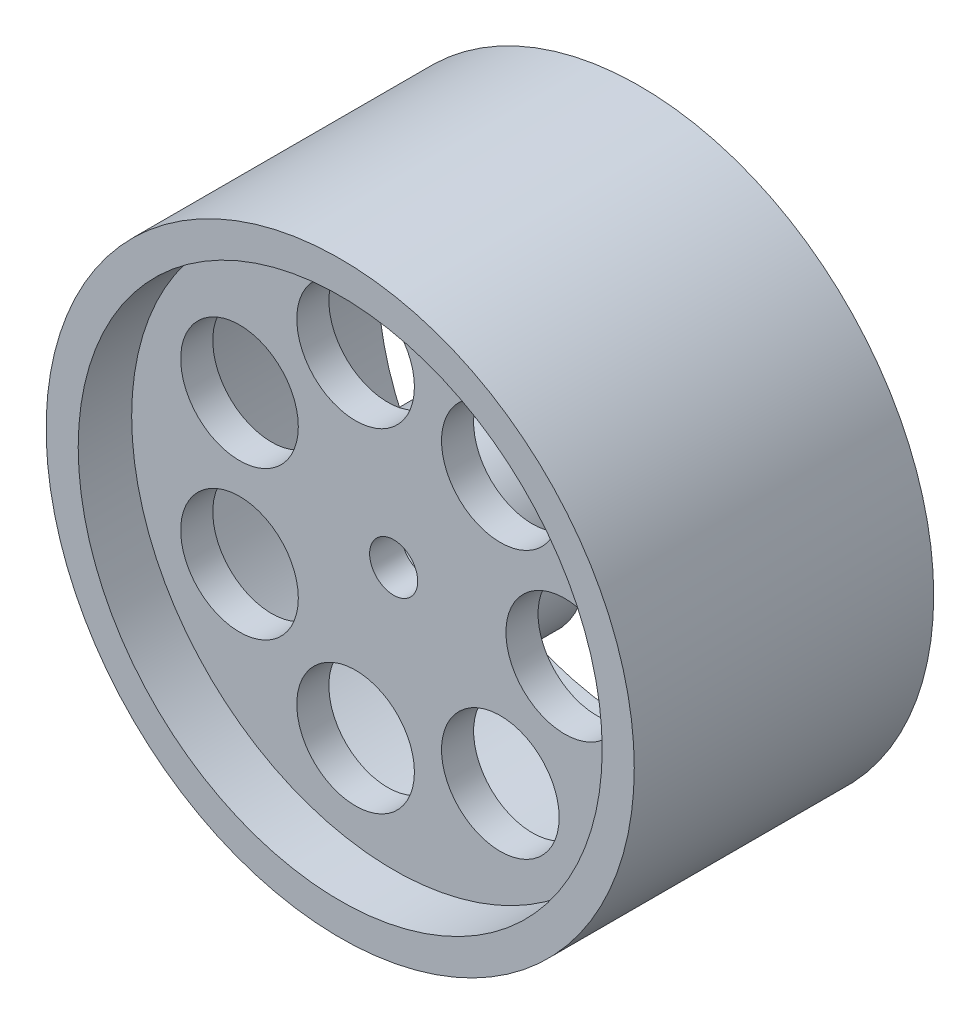
ISO-10303-21;
HEADER;
FILE_DESCRIPTION(('STEP AP214'),'2;1');
FILE_NAME('part.step','',(''),(''),'','','');
FILE_SCHEMA(('AUTOMOTIVE_DESIGN { 1 0 10303 214 1 1 1 1 }'));
ENDSEC;
DATA;
#1=APPLICATION_CONTEXT('core data for automotive mechanical design processes');
#2=APPLICATION_PROTOCOL_DEFINITION('international standard','automotive_design',2000,#1);
#3=PRODUCT_CONTEXT('',#1,'mechanical');
#4=PRODUCT('Part','Part','',(#3));
#5=PRODUCT_RELATED_PRODUCT_CATEGORY('part','',(#4));
#6=PRODUCT_DEFINITION_FORMATION('','',#4);
#7=PRODUCT_DEFINITION_CONTEXT('part definition',#1,'design');
#8=PRODUCT_DEFINITION('design','',#6,#7);
#9=PRODUCT_DEFINITION_SHAPE('','',#8);
#10=(LENGTH_UNIT() NAMED_UNIT(*) SI_UNIT(.MILLI.,.METRE.));
#11=(NAMED_UNIT(*) PLANE_ANGLE_UNIT() SI_UNIT($,.RADIAN.));
#12=(NAMED_UNIT(*) SI_UNIT($,.STERADIAN.) SOLID_ANGLE_UNIT());
#13=UNCERTAINTY_MEASURE_WITH_UNIT(LENGTH_MEASURE(1.E-05),#10,'distance_accuracy_value','');
#14=(GEOMETRIC_REPRESENTATION_CONTEXT(3) GLOBAL_UNCERTAINTY_ASSIGNED_CONTEXT((#13)) GLOBAL_UNIT_ASSIGNED_CONTEXT((#10,
#11,#12)) REPRESENTATION_CONTEXT('',''));
#15=CARTESIAN_POINT('',(0.,0.,0.));
#16=DIRECTION('',(0.,0.,1.));
#17=DIRECTION('',(1.,0.,0.));
#18=AXIS2_PLACEMENT_3D('',#15,#16,#17);
#19=CARTESIAN_POINT('',(0.,0.,6.));
#20=DIRECTION('',(0.,0.,1.));
#21=DIRECTION('',(1.,0.,0.));
#22=AXIS2_PLACEMENT_3D('',#19,#20,#21);
#23=PLANE('',#22);
#24=CARTESIAN_POINT('',(9.97583682973973,-12.5093037194885,6.));
#25=DIRECTION('',(0.,0.,1.));
#26=DIRECTION('',(1.,0.,0.));
#27=AXIS2_PLACEMENT_3D('',#24,#25,#26);
#28=CIRCLE('',#27,5.5);
#29=CARTESIAN_POINT('',(15.4758368297397,-12.5093037194885,6.));
#30=VERTEX_POINT('',#29);
#31=EDGE_CURVE('E152',#30,#30,#28,.T.);
#32=ORIENTED_EDGE('',*,*,#31,.T.);
#33=EDGE_LOOP('',(#32));
#34=FACE_BOUND('',#33,.T.);
#35=CARTESIAN_POINT('',(-3.56033494330102,-15.5988465949092,6.));
#36=DIRECTION('',(0.,0.,1.));
#37=DIRECTION('',(1.,0.,0.));
#38=AXIS2_PLACEMENT_3D('',#35,#36,#37);
#39=CIRCLE('',#38,5.5);
#40=CARTESIAN_POINT('',(1.93966505669898,-15.5988465949092,6.));
#41=VERTEX_POINT('',#40);
#42=EDGE_CURVE('E156',#41,#41,#39,.T.);
#43=ORIENTED_EDGE('',*,*,#42,.T.);
#44=EDGE_LOOP('',(#43));
#45=FACE_BOUND('',#44,.T.);
#46=CARTESIAN_POINT('',(-14.4155018864387,-6.94213982588093,6.));
#47=DIRECTION('',(0.,0.,1.));
#48=DIRECTION('',(1.,0.,0.));
#49=AXIS2_PLACEMENT_3D('',#46,#47,#48);
#50=CIRCLE('',#49,5.5);
#51=CARTESIAN_POINT('',(-8.91550188643871,-6.94213982588093,6.));
#52=VERTEX_POINT('',#51);
#53=EDGE_CURVE('E162',#52,#52,#50,.T.);
#54=ORIENTED_EDGE('',*,*,#53,.T.);
#55=EDGE_LOOP('',(#54));
#56=FACE_BOUND('',#55,.T.);
#57=CARTESIAN_POINT('',(-14.4155018864387,6.94213982588093,6.));
#58=DIRECTION('',(0.,0.,1.));
#59=DIRECTION('',(1.,0.,0.));
#60=AXIS2_PLACEMENT_3D('',#57,#58,#59);
#61=CIRCLE('',#60,5.5);
#62=CARTESIAN_POINT('',(-8.9155018864387,6.94213982588093,6.));
#63=VERTEX_POINT('',#62);
#64=EDGE_CURVE('E168',#63,#63,#61,.T.);
#65=ORIENTED_EDGE('',*,*,#64,.T.);
#66=EDGE_LOOP('',(#65));
#67=FACE_BOUND('',#66,.T.);
#68=CARTESIAN_POINT('',(-3.56033494330103,15.5988465949092,6.));
#69=DIRECTION('',(0.,0.,1.));
#70=DIRECTION('',(1.,0.,0.));
#71=AXIS2_PLACEMENT_3D('',#68,#69,#70);
#72=CIRCLE('',#71,5.5);
#73=CARTESIAN_POINT('',(1.93966505669897,15.5988465949092,6.));
#74=VERTEX_POINT('',#73);
#75=EDGE_CURVE('E174',#74,#74,#72,.T.);
#76=ORIENTED_EDGE('',*,*,#75,.T.);
#77=EDGE_LOOP('',(#76));
#78=FACE_BOUND('',#77,.T.);
#79=CARTESIAN_POINT('',(9.97583682973974,12.5093037194885,6.));
#80=DIRECTION('',(0.,0.,1.));
#81=DIRECTION('',(1.,0.,0.));
#82=AXIS2_PLACEMENT_3D('',#79,#80,#81);
#83=CIRCLE('',#82,5.5);
#84=CARTESIAN_POINT('',(15.4758368297397,12.5093037194885,6.));
#85=VERTEX_POINT('',#84);
#86=EDGE_CURVE('E180',#85,#85,#83,.T.);
#87=ORIENTED_EDGE('',*,*,#86,.T.);
#88=EDGE_LOOP('',(#87));
#89=FACE_BOUND('',#88,.T.);
#90=CARTESIAN_POINT('',(16.,0.,6.));
#91=DIRECTION('',(0.,0.,1.));
#92=DIRECTION('',(1.,0.,0.));
#93=AXIS2_PLACEMENT_3D('',#90,#91,#92);
#94=CIRCLE('',#93,5.5);
#95=CARTESIAN_POINT('',(21.5,0.,6.));
#96=VERTEX_POINT('',#95);
#97=EDGE_CURVE('E186',#96,#96,#94,.T.);
#98=ORIENTED_EDGE('',*,*,#97,.T.);
#99=EDGE_LOOP('',(#98));
#100=FACE_BOUND('',#99,.T.);
#101=CARTESIAN_POINT('',(0.,0.,6.));
#102=DIRECTION('',(0.,0.,1.));
#103=DIRECTION('',(1.,0.,0.));
#104=AXIS2_PLACEMENT_3D('',#101,#102,#103);
#105=CIRCLE('',#104,24.5);
#106=CARTESIAN_POINT('',(24.5,0.,6.));
#107=VERTEX_POINT('',#106);
#108=EDGE_CURVE('E198',#107,#107,#105,.T.);
#109=ORIENTED_EDGE('',*,*,#108,.F.);
#110=EDGE_LOOP('',(#109));
#111=FACE_BOUND('',#110,.T.);
#112=CARTESIAN_POINT('',(0.,0.,6.));
#113=DIRECTION('',(0.,0.,1.));
#114=DIRECTION('',(1.,0.,0.));
#115=AXIS2_PLACEMENT_3D('',#112,#113,#114);
#116=CIRCLE('',#115,9.);
#117=CARTESIAN_POINT('',(9.,0.,6.));
#118=VERTEX_POINT('',#117);
#119=EDGE_CURVE('E11',#118,#118,#116,.F.);
#120=ORIENTED_EDGE('',*,*,#119,.F.);
#121=EDGE_LOOP('',(#120));
#122=FACE_BOUND('',#121,.T.);
#123=ADVANCED_FACE('F43',(#34,#45,#56,#67,#78,#89,#100,#111,#122),#23,.F.);
#124=CARTESIAN_POINT('',(0.,0.,14.));
#125=DIRECTION('',(0.,0.,-1.));
#126=DIRECTION('',(-1.,0.,0.));
#127=AXIS2_PLACEMENT_3D('',#124,#125,#126);
#128=CYLINDRICAL_SURFACE('',#127,24.5);
#129=CARTESIAN_POINT('',(0.,0.,-14.));
#130=DIRECTION('',(0.,0.,1.));
#131=DIRECTION('',(1.,0.,0.));
#132=AXIS2_PLACEMENT_3D('',#129,#130,#131);
#133=CIRCLE('',#132,24.5);
#134=CARTESIAN_POINT('',(24.5,0.,-14.));
#135=VERTEX_POINT('',#134);
#136=EDGE_CURVE('E205',#135,#135,#133,.T.);
#137=ORIENTED_EDGE('',*,*,#136,.F.);
#138=EDGE_LOOP('',(#137));
#139=FACE_BOUND('',#138,.T.);
#140=ORIENTED_EDGE('',*,*,#108,.T.);
#141=EDGE_LOOP('',(#140));
#142=FACE_BOUND('',#141,.T.);
#143=ADVANCED_FACE('F223',(#139,#142),#128,.F.);
#144=CARTESIAN_POINT('',(0.,0.,14.));
#145=DIRECTION('',(0.,0.,1.));
#146=DIRECTION('',(1.,0.,0.));
#147=AXIS2_PLACEMENT_3D('',#144,#145,#146);
#148=PLANE('',#147);
#149=CARTESIAN_POINT('',(0.,0.,14.));
#150=DIRECTION('',(0.,0.,1.));
#151=DIRECTION('',(1.,0.,0.));
#152=AXIS2_PLACEMENT_3D('',#149,#150,#151);
#153=CIRCLE('',#152,27.5);
#154=CARTESIAN_POINT('',(27.5,0.,14.));
#155=VERTEX_POINT('',#154);
#156=EDGE_CURVE('E208',#155,#155,#153,.T.);
#157=ORIENTED_EDGE('',*,*,#156,.T.);
#158=EDGE_LOOP('',(#157));
#159=FACE_BOUND('',#158,.T.);
#160=CARTESIAN_POINT('',(0.,0.,14.));
#161=DIRECTION('',(0.,0.,1.));
#162=DIRECTION('',(1.,0.,0.));
#163=AXIS2_PLACEMENT_3D('',#160,#161,#162);
#164=CIRCLE('',#163,24.5);
#165=CARTESIAN_POINT('',(24.5,0.,14.));
#166=VERTEX_POINT('',#165);
#167=EDGE_CURVE('E201',#166,#166,#164,.T.);
#168=ORIENTED_EDGE('',*,*,#167,.F.);
#169=EDGE_LOOP('',(#168));
#170=FACE_BOUND('',#169,.T.);
#171=ADVANCED_FACE('F226',(#159,#170),#148,.T.);
#172=CARTESIAN_POINT('',(0.,0.,-14.));
#173=DIRECTION('',(0.,0.,1.));
#174=DIRECTION('',(1.,0.,0.));
#175=AXIS2_PLACEMENT_3D('',#172,#173,#174);
#176=PLANE('',#175);
#177=CARTESIAN_POINT('',(0.,0.,-14.));
#178=DIRECTION('',(0.,0.,1.));
#179=DIRECTION('',(1.,0.,0.));
#180=AXIS2_PLACEMENT_3D('',#177,#178,#179);
#181=CIRCLE('',#180,27.5);
#182=CARTESIAN_POINT('',(27.5,0.,-14.));
#183=VERTEX_POINT('',#182);
#184=EDGE_CURVE('E204',#183,#183,#181,.T.);
#185=ORIENTED_EDGE('',*,*,#184,.F.);
#186=EDGE_LOOP('',(#185));
#187=FACE_BOUND('',#186,.T.);
#188=ORIENTED_EDGE('',*,*,#136,.T.);
#189=EDGE_LOOP('',(#188));
#190=FACE_BOUND('',#189,.T.);
#191=ADVANCED_FACE('F228',(#187,#190),#176,.F.);
#192=CARTESIAN_POINT('',(0.,0.,14.));
#193=DIRECTION('',(0.,0.,-1.));
#194=DIRECTION('',(-1.,0.,0.));
#195=AXIS2_PLACEMENT_3D('',#192,#193,#194);
#196=CYLINDRICAL_SURFACE('',#195,27.5);
#197=ORIENTED_EDGE('',*,*,#156,.F.);
#198=EDGE_LOOP('',(#197));
#199=FACE_BOUND('',#198,.T.);
#200=ORIENTED_EDGE('',*,*,#184,.T.);
#201=EDGE_LOOP('',(#200));
#202=FACE_BOUND('',#201,.T.);
#203=ADVANCED_FACE('F45',(#199,#202),#196,.T.);
#204=CARTESIAN_POINT('',(0.,0.,9.));
#205=DIRECTION('',(0.,0.,1.));
#206=DIRECTION('',(1.,0.,0.));
#207=AXIS2_PLACEMENT_3D('',#204,#205,#206);
#208=CIRCLE('',#207,24.5);
#209=CARTESIAN_POINT('',(24.5,0.,9.));
#210=VERTEX_POINT('',#209);
#211=EDGE_CURVE('E51',#210,#210,#208,.T.);
#212=ORIENTED_EDGE('',*,*,#211,.F.);
#213=EDGE_LOOP('',(#212));
#214=FACE_BOUND('',#213,.T.);
#215=ORIENTED_EDGE('',*,*,#167,.T.);
#216=EDGE_LOOP('',(#215));
#217=FACE_BOUND('',#216,.T.);
#218=ADVANCED_FACE('F219',(#214,#217),#128,.F.);
#219=CARTESIAN_POINT('',(0.,0.,9.));
#220=DIRECTION('',(0.,0.,1.));
#221=DIRECTION('',(1.,0.,0.));
#222=AXIS2_PLACEMENT_3D('',#219,#220,#221);
#223=PLANE('',#222);
#224=CARTESIAN_POINT('',(9.97583682973973,-12.5093037194885,9.));
#225=DIRECTION('',(0.,0.,1.));
#226=DIRECTION('',(1.,0.,0.));
#227=AXIS2_PLACEMENT_3D('',#224,#225,#226);
#228=CIRCLE('',#227,5.5);
#229=CARTESIAN_POINT('',(15.4758368297397,-12.5093037194885,9.));
#230=VERTEX_POINT('',#229);
#231=EDGE_CURVE('E153',#230,#230,#228,.T.);
#232=ORIENTED_EDGE('',*,*,#231,.F.);
#233=EDGE_LOOP('',(#232));
#234=FACE_BOUND('',#233,.T.);
#235=CARTESIAN_POINT('',(-14.4155018864387,-6.94213982588093,9.));
#236=DIRECTION('',(0.,0.,1.));
#237=DIRECTION('',(1.,0.,0.));
#238=AXIS2_PLACEMENT_3D('',#235,#236,#237);
#239=CIRCLE('',#238,5.5);
#240=CARTESIAN_POINT('',(-8.91550188643871,-6.94213982588093,9.));
#241=VERTEX_POINT('',#240);
#242=EDGE_CURVE('E165',#241,#241,#239,.T.);
#243=ORIENTED_EDGE('',*,*,#242,.F.);
#244=EDGE_LOOP('',(#243));
#245=FACE_BOUND('',#244,.T.);
#246=CARTESIAN_POINT('',(-3.56033494330103,15.5988465949092,9.));
#247=DIRECTION('',(0.,0.,1.));
#248=DIRECTION('',(1.,0.,0.));
#249=AXIS2_PLACEMENT_3D('',#246,#247,#248);
#250=CIRCLE('',#249,5.5);
#251=CARTESIAN_POINT('',(1.93966505669897,15.5988465949092,9.));
#252=VERTEX_POINT('',#251);
#253=EDGE_CURVE('E177',#252,#252,#250,.T.);
#254=ORIENTED_EDGE('',*,*,#253,.F.);
#255=EDGE_LOOP('',(#254));
#256=FACE_BOUND('',#255,.T.);
#257=CARTESIAN_POINT('',(16.,0.,9.));
#258=DIRECTION('',(0.,0.,1.));
#259=DIRECTION('',(1.,0.,0.));
#260=AXIS2_PLACEMENT_3D('',#257,#258,#259);
#261=CIRCLE('',#260,5.5);
#262=CARTESIAN_POINT('',(21.5,0.,9.));
#263=VERTEX_POINT('',#262);
#264=EDGE_CURVE('E189',#263,#263,#261,.T.);
#265=ORIENTED_EDGE('',*,*,#264,.F.);
#266=EDGE_LOOP('',(#265));
#267=FACE_BOUND('',#266,.T.);
#268=CARTESIAN_POINT('',(0.,0.,9.));
#269=DIRECTION('',(0.,0.,1.));
#270=DIRECTION('',(1.,0.,0.));
#271=AXIS2_PLACEMENT_3D('',#268,#269,#270);
#272=CIRCLE('',#271,2.25);
#273=CARTESIAN_POINT('',(2.25,0.,9.));
#274=VERTEX_POINT('',#273);
#275=EDGE_CURVE('E195',#274,#274,#272,.T.);
#276=ORIENTED_EDGE('',*,*,#275,.F.);
#277=EDGE_LOOP('',(#276));
#278=FACE_BOUND('',#277,.T.);
#279=CARTESIAN_POINT('',(9.97583682973974,12.5093037194885,9.));
#280=DIRECTION('',(0.,0.,1.));
#281=DIRECTION('',(1.,0.,0.));
#282=AXIS2_PLACEMENT_3D('',#279,#280,#281);
#283=CIRCLE('',#282,5.5);
#284=CARTESIAN_POINT('',(15.4758368297397,12.5093037194885,9.));
#285=VERTEX_POINT('',#284);
#286=EDGE_CURVE('E183',#285,#285,#283,.T.);
#287=ORIENTED_EDGE('',*,*,#286,.F.);
#288=EDGE_LOOP('',(#287));
#289=FACE_BOUND('',#288,.T.);
#290=CARTESIAN_POINT('',(-14.4155018864387,6.94213982588093,9.));
#291=DIRECTION('',(0.,0.,1.));
#292=DIRECTION('',(1.,0.,0.));
#293=AXIS2_PLACEMENT_3D('',#290,#291,#292);
#294=CIRCLE('',#293,5.5);
#295=CARTESIAN_POINT('',(-8.9155018864387,6.94213982588093,9.));
#296=VERTEX_POINT('',#295);
#297=EDGE_CURVE('E171',#296,#296,#294,.T.);
#298=ORIENTED_EDGE('',*,*,#297,.F.);
#299=EDGE_LOOP('',(#298));
#300=FACE_BOUND('',#299,.T.);
#301=CARTESIAN_POINT('',(-3.56033494330102,-15.5988465949092,9.));
#302=DIRECTION('',(0.,0.,1.));
#303=DIRECTION('',(1.,0.,0.));
#304=AXIS2_PLACEMENT_3D('',#301,#302,#303);
#305=CIRCLE('',#304,5.5);
#306=CARTESIAN_POINT('',(1.93966505669898,-15.5988465949092,9.));
#307=VERTEX_POINT('',#306);
#308=EDGE_CURVE('E159',#307,#307,#305,.T.);
#309=ORIENTED_EDGE('',*,*,#308,.F.);
#310=EDGE_LOOP('',(#309));
#311=FACE_BOUND('',#310,.T.);
#312=ORIENTED_EDGE('',*,*,#211,.T.);
#313=EDGE_LOOP('',(#312));
#314=FACE_BOUND('',#313,.T.);
#315=ADVANCED_FACE('F217',(#234,#245,#256,#267,#278,#289,#300,#311,#314),#223,.T.);
#316=DIRECTION('',(-0.866025403784439,0.5,0.));
#317=VECTOR('',#316,1.);
#318=CARTESIAN_POINT('',(6.06,3.49874263128913,6.));
#319=LINE('',#318,#317);
#320=CARTESIAN_POINT('',(6.06,3.49874263128913,6.));
#321=VERTEX_POINT('',#320);
#322=CARTESIAN_POINT('',(0.,6.99748526257826,6.));
#323=VERTEX_POINT('',#322);
#324=EDGE_CURVE('E105',#321,#323,#319,.T.);
#325=ORIENTED_EDGE('',*,*,#324,.F.);
#326=DIRECTION('',(0.,1.,0.));
#327=VECTOR('',#326,1.);
#328=CARTESIAN_POINT('',(6.06,-3.49874263128914,6.));
#329=LINE('',#328,#327);
#330=CARTESIAN_POINT('',(6.06,-3.49874263128914,6.));
#331=VERTEX_POINT('',#330);
#332=EDGE_CURVE('E97',#331,#321,#329,.T.);
#333=ORIENTED_EDGE('',*,*,#332,.F.);
#334=DIRECTION('',(0.866025403784439,0.5,0.));
#335=VECTOR('',#334,1.);
#336=CARTESIAN_POINT('',(0.,-6.99748526257826,6.));
#337=LINE('',#336,#335);
#338=CARTESIAN_POINT('',(0.,-6.99748526257826,6.));
#339=VERTEX_POINT('',#338);
#340=EDGE_CURVE('E127',#339,#331,#337,.T.);
#341=ORIENTED_EDGE('',*,*,#340,.F.);
#342=DIRECTION('',(0.866025403784439,-0.5,0.));
#343=VECTOR('',#342,1.);
#344=CARTESIAN_POINT('',(-6.06,-3.49874263128913,6.));
#345=LINE('',#344,#343);
#346=CARTESIAN_POINT('',(-6.06,-3.49874263128913,6.));
#347=VERTEX_POINT('',#346);
#348=EDGE_CURVE('E58',#347,#339,#345,.T.);
#349=ORIENTED_EDGE('',*,*,#348,.F.);
#350=DIRECTION('',(0.,-1.,0.));
#351=VECTOR('',#350,1.);
#352=CARTESIAN_POINT('',(-6.06,3.49874263128913,6.));
#353=LINE('',#352,#351);
#354=CARTESIAN_POINT('',(-6.06,3.49874263128913,6.));
#355=VERTEX_POINT('',#354);
#356=EDGE_CURVE('E122',#355,#347,#353,.T.);
#357=ORIENTED_EDGE('',*,*,#356,.F.);
#358=DIRECTION('',(-0.866025403784439,-0.5,0.));
#359=VECTOR('',#358,1.);
#360=CARTESIAN_POINT('',(0.,6.99748526257826,6.));
#361=LINE('',#360,#359);
#362=EDGE_CURVE('E120',#323,#355,#361,.T.);
#363=ORIENTED_EDGE('',*,*,#362,.F.);
#364=EDGE_LOOP('',(#325,#333,#341,#349,#357,#363));
#365=FACE_BOUND('',#364,.T.);
#366=CARTESIAN_POINT('',(0.,0.,6.));
#367=DIRECTION('',(0.,0.,1.));
#368=DIRECTION('',(1.,0.,0.));
#369=AXIS2_PLACEMENT_3D('',#366,#367,#368);
#370=CIRCLE('',#369,2.25);
#371=CARTESIAN_POINT('',(2.25,0.,6.));
#372=VERTEX_POINT('',#371);
#373=EDGE_CURVE('E192',#372,#372,#370,.T.);
#374=ORIENTED_EDGE('',*,*,#373,.T.);
#375=EDGE_LOOP('',(#374));
#376=FACE_BOUND('',#375,.T.);
#377=ADVANCED_FACE('F117',(#365,#376),#23,.F.);
#378=CARTESIAN_POINT('',(0.,0.,9.));
#379=DIRECTION('',(0.,0.,-1.));
#380=DIRECTION('',(-1.,0.,0.));
#381=AXIS2_PLACEMENT_3D('',#378,#379,#380);
#382=CYLINDRICAL_SURFACE('',#381,2.25);
#383=ORIENTED_EDGE('',*,*,#275,.T.);
#384=EDGE_LOOP('',(#383));
#385=FACE_BOUND('',#384,.T.);
#386=ORIENTED_EDGE('',*,*,#373,.F.);
#387=EDGE_LOOP('',(#386));
#388=FACE_BOUND('',#387,.T.);
#389=ADVANCED_FACE('F246',(#385,#388),#382,.F.);
#390=CARTESIAN_POINT('',(16.,0.,9.));
#391=DIRECTION('',(0.,0.,-1.));
#392=DIRECTION('',(-1.,0.,0.));
#393=AXIS2_PLACEMENT_3D('',#390,#391,#392);
#394=CYLINDRICAL_SURFACE('',#393,5.5);
#395=ORIENTED_EDGE('',*,*,#264,.T.);
#396=EDGE_LOOP('',(#395));
#397=FACE_BOUND('',#396,.T.);
#398=ORIENTED_EDGE('',*,*,#97,.F.);
#399=EDGE_LOOP('',(#398));
#400=FACE_BOUND('',#399,.T.);
#401=ADVANCED_FACE('F251',(#397,#400),#394,.F.);
#402=CARTESIAN_POINT('',(9.97583682973974,12.5093037194885,9.));
#403=DIRECTION('',(0.,0.,-1.));
#404=DIRECTION('',(-1.,0.,0.));
#405=AXIS2_PLACEMENT_3D('',#402,#403,#404);
#406=CYLINDRICAL_SURFACE('',#405,5.5);
#407=ORIENTED_EDGE('',*,*,#286,.T.);
#408=EDGE_LOOP('',(#407));
#409=FACE_BOUND('',#408,.T.);
#410=ORIENTED_EDGE('',*,*,#86,.F.);
#411=EDGE_LOOP('',(#410));
#412=FACE_BOUND('',#411,.T.);
#413=ADVANCED_FACE('F263',(#409,#412),#406,.F.);
#414=CARTESIAN_POINT('',(-3.56033494330103,15.5988465949092,9.));
#415=DIRECTION('',(0.,0.,-1.));
#416=DIRECTION('',(-1.,0.,0.));
#417=AXIS2_PLACEMENT_3D('',#414,#415,#416);
#418=CYLINDRICAL_SURFACE('',#417,5.5);
#419=ORIENTED_EDGE('',*,*,#253,.T.);
#420=EDGE_LOOP('',(#419));
#421=FACE_BOUND('',#420,.T.);
#422=ORIENTED_EDGE('',*,*,#75,.F.);
#423=EDGE_LOOP('',(#422));
#424=FACE_BOUND('',#423,.T.);
#425=ADVANCED_FACE('F267',(#421,#424),#418,.F.);
#426=CARTESIAN_POINT('',(-14.4155018864387,6.94213982588093,9.));
#427=DIRECTION('',(0.,0.,-1.));
#428=DIRECTION('',(-1.,0.,0.));
#429=AXIS2_PLACEMENT_3D('',#426,#427,#428);
#430=CYLINDRICAL_SURFACE('',#429,5.5);
#431=ORIENTED_EDGE('',*,*,#297,.T.);
#432=EDGE_LOOP('',(#431));
#433=FACE_BOUND('',#432,.T.);
#434=ORIENTED_EDGE('',*,*,#64,.F.);
#435=EDGE_LOOP('',(#434));
#436=FACE_BOUND('',#435,.T.);
#437=ADVANCED_FACE('F271',(#433,#436),#430,.F.);
#438=CARTESIAN_POINT('',(-14.4155018864387,-6.94213982588093,9.));
#439=DIRECTION('',(0.,0.,-1.));
#440=DIRECTION('',(-1.,0.,0.));
#441=AXIS2_PLACEMENT_3D('',#438,#439,#440);
#442=CYLINDRICAL_SURFACE('',#441,5.5);
#443=ORIENTED_EDGE('',*,*,#242,.T.);
#444=EDGE_LOOP('',(#443));
#445=FACE_BOUND('',#444,.T.);
#446=ORIENTED_EDGE('',*,*,#53,.F.);
#447=EDGE_LOOP('',(#446));
#448=FACE_BOUND('',#447,.T.);
#449=ADVANCED_FACE('F275',(#445,#448),#442,.F.);
#450=CARTESIAN_POINT('',(-3.56033494330102,-15.5988465949092,9.));
#451=DIRECTION('',(0.,0.,-1.));
#452=DIRECTION('',(-1.,0.,0.));
#453=AXIS2_PLACEMENT_3D('',#450,#451,#452);
#454=CYLINDRICAL_SURFACE('',#453,5.5);
#455=ORIENTED_EDGE('',*,*,#308,.T.);
#456=EDGE_LOOP('',(#455));
#457=FACE_BOUND('',#456,.T.);
#458=ORIENTED_EDGE('',*,*,#42,.F.);
#459=EDGE_LOOP('',(#458));
#460=FACE_BOUND('',#459,.T.);
#461=ADVANCED_FACE('F279',(#457,#460),#454,.F.);
#462=CARTESIAN_POINT('',(9.97583682973973,-12.5093037194885,9.));
#463=DIRECTION('',(0.,0.,-1.));
#464=DIRECTION('',(-1.,0.,0.));
#465=AXIS2_PLACEMENT_3D('',#462,#463,#464);
#466=CYLINDRICAL_SURFACE('',#465,5.5);
#467=ORIENTED_EDGE('',*,*,#231,.T.);
#468=EDGE_LOOP('',(#467));
#469=FACE_BOUND('',#468,.T.);
#470=ORIENTED_EDGE('',*,*,#31,.F.);
#471=EDGE_LOOP('',(#470));
#472=FACE_BOUND('',#471,.T.);
#473=ADVANCED_FACE('F283',(#469,#472),#466,.F.);
#474=CARTESIAN_POINT('',(0.,0.,0.));
#475=DIRECTION('',(0.,0.,1.));
#476=DIRECTION('',(1.,0.,0.));
#477=AXIS2_PLACEMENT_3D('',#474,#475,#476);
#478=PLANE('',#477);
#479=CARTESIAN_POINT('',(0.,0.,0.));
#480=DIRECTION('',(0.,0.,1.));
#481=DIRECTION('',(1.,0.,0.));
#482=AXIS2_PLACEMENT_3D('',#479,#480,#481);
#483=CIRCLE('',#482,9.);
#484=CARTESIAN_POINT('',(9.,0.,0.));
#485=VERTEX_POINT('',#484);
#486=EDGE_CURVE('E113',#485,#485,#483,.T.);
#487=ORIENTED_EDGE('',*,*,#486,.F.);
#488=EDGE_LOOP('',(#487));
#489=FACE_BOUND('',#488,.T.);
#490=DIRECTION('',(0.,1.,0.));
#491=VECTOR('',#490,1.);
#492=CARTESIAN_POINT('',(6.06,-3.49874263128914,0.));
#493=LINE('',#492,#491);
#494=CARTESIAN_POINT('',(6.06,-3.49874263128913,0.));
#495=VERTEX_POINT('',#494);
#496=CARTESIAN_POINT('',(6.06,3.49874263128913,0.));
#497=VERTEX_POINT('',#496);
#498=EDGE_CURVE('E66',#495,#497,#493,.T.);
#499=ORIENTED_EDGE('',*,*,#498,.T.);
#500=DIRECTION('',(-0.866025403784439,0.5,0.));
#501=VECTOR('',#500,1.);
#502=CARTESIAN_POINT('',(6.06,3.49874263128913,0.));
#503=LINE('',#502,#501);
#504=CARTESIAN_POINT('',(0.,6.99748526257826,0.));
#505=VERTEX_POINT('',#504);
#506=EDGE_CURVE('E112',#497,#505,#503,.T.);
#507=ORIENTED_EDGE('',*,*,#506,.T.);
#508=DIRECTION('',(-0.866025403784439,-0.5,0.));
#509=VECTOR('',#508,1.);
#510=CARTESIAN_POINT('',(0.,6.99748526257826,0.));
#511=LINE('',#510,#509);
#512=CARTESIAN_POINT('',(-6.06,3.49874263128913,0.));
#513=VERTEX_POINT('',#512);
#514=EDGE_CURVE('E131',#505,#513,#511,.T.);
#515=ORIENTED_EDGE('',*,*,#514,.T.);
#516=DIRECTION('',(0.,-1.,0.));
#517=VECTOR('',#516,1.);
#518=CARTESIAN_POINT('',(-6.06,3.49874263128913,0.));
#519=LINE('',#518,#517);
#520=CARTESIAN_POINT('',(-6.06,-3.49874263128913,0.));
#521=VERTEX_POINT('',#520);
#522=EDGE_CURVE('E134',#513,#521,#519,.T.);
#523=ORIENTED_EDGE('',*,*,#522,.T.);
#524=DIRECTION('',(0.866025403784439,-0.5,0.));
#525=VECTOR('',#524,1.);
#526=CARTESIAN_POINT('',(-6.06,-3.49874263128913,0.));
#527=LINE('',#526,#525);
#528=CARTESIAN_POINT('',(0.,-6.99748526257826,0.));
#529=VERTEX_POINT('',#528);
#530=EDGE_CURVE('E137',#521,#529,#527,.T.);
#531=ORIENTED_EDGE('',*,*,#530,.T.);
#532=DIRECTION('',(0.866025403784439,0.5,0.));
#533=VECTOR('',#532,1.);
#534=CARTESIAN_POINT('',(0.,-6.99748526257826,0.));
#535=LINE('',#534,#533);
#536=EDGE_CURVE('E106',#529,#495,#535,.T.);
#537=ORIENTED_EDGE('',*,*,#536,.T.);
#538=EDGE_LOOP('',(#499,#507,#515,#523,#531,#537));
#539=FACE_BOUND('',#538,.T.);
#540=ADVANCED_FACE('F286',(#489,#539),#478,.F.);
#541=CARTESIAN_POINT('',(0.,0.,6.));
#542=DIRECTION('',(0.,0.,-1.));
#543=DIRECTION('',(-1.,0.,0.));
#544=AXIS2_PLACEMENT_3D('',#541,#542,#543);
#545=CYLINDRICAL_SURFACE('',#544,9.);
#546=ORIENTED_EDGE('',*,*,#119,.T.);
#547=EDGE_LOOP('',(#546));
#548=FACE_BOUND('',#547,.T.);
#549=ORIENTED_EDGE('',*,*,#486,.T.);
#550=EDGE_LOOP('',(#549));
#551=FACE_BOUND('',#550,.T.);
#552=ADVANCED_FACE('F288',(#548,#551),#545,.T.);
#553=CARTESIAN_POINT('',(6.06,-3.49874263128914,6.));
#554=DIRECTION('',(-1.,0.,0.));
#555=DIRECTION('',(0.,-1.,0.));
#556=AXIS2_PLACEMENT_3D('',#553,#554,#555);
#557=PLANE('',#556);
#558=ORIENTED_EDGE('',*,*,#498,.F.);
#559=DIRECTION('',(0.,0.,-1.));
#560=VECTOR('',#559,1.);
#561=CARTESIAN_POINT('',(6.06,-3.49874263128914,6.));
#562=LINE('',#561,#560);
#563=EDGE_CURVE('E101',#331,#495,#562,.T.);
#564=ORIENTED_EDGE('',*,*,#563,.F.);
#565=ORIENTED_EDGE('',*,*,#332,.T.);
#566=DIRECTION('',(0.,0.,-1.));
#567=VECTOR('',#566,1.);
#568=CARTESIAN_POINT('',(6.06,3.49874263128913,6.));
#569=LINE('',#568,#567);
#570=EDGE_CURVE('E100',#321,#497,#569,.T.);
#571=ORIENTED_EDGE('',*,*,#570,.T.);
#572=EDGE_LOOP('',(#558,#564,#565,#571));
#573=FACE_BOUND('',#572,.T.);
#574=ADVANCED_FACE('F99',(#573),#557,.T.);
#575=CARTESIAN_POINT('',(6.06,3.49874263128913,6.));
#576=DIRECTION('',(-0.5,-0.866025403784439,0.));
#577=DIRECTION('',(0.866025403784439,-0.5,0.));
#578=AXIS2_PLACEMENT_3D('',#575,#576,#577);
#579=PLANE('',#578);
#580=ORIENTED_EDGE('',*,*,#506,.F.);
#581=ORIENTED_EDGE('',*,*,#570,.F.);
#582=ORIENTED_EDGE('',*,*,#324,.T.);
#583=DIRECTION('',(0.,0.,-1.));
#584=VECTOR('',#583,1.);
#585=CARTESIAN_POINT('',(0.,6.99748526257826,6.));
#586=LINE('',#585,#584);
#587=EDGE_CURVE('E114',#323,#505,#586,.T.);
#588=ORIENTED_EDGE('',*,*,#587,.T.);
#589=EDGE_LOOP('',(#580,#581,#582,#588));
#590=FACE_BOUND('',#589,.T.);
#591=ADVANCED_FACE('F109',(#590),#579,.T.);
#592=CARTESIAN_POINT('',(0.,6.99748526257826,6.));
#593=DIRECTION('',(0.5,-0.866025403784439,0.));
#594=DIRECTION('',(0.866025403784439,0.5,0.));
#595=AXIS2_PLACEMENT_3D('',#592,#593,#594);
#596=PLANE('',#595);
#597=ORIENTED_EDGE('',*,*,#514,.F.);
#598=ORIENTED_EDGE('',*,*,#587,.F.);
#599=ORIENTED_EDGE('',*,*,#362,.T.);
#600=DIRECTION('',(0.,0.,-1.));
#601=VECTOR('',#600,1.);
#602=CARTESIAN_POINT('',(-6.06,3.49874263128913,6.));
#603=LINE('',#602,#601);
#604=EDGE_CURVE('E147',#355,#513,#603,.T.);
#605=ORIENTED_EDGE('',*,*,#604,.T.);
#606=EDGE_LOOP('',(#597,#598,#599,#605));
#607=FACE_BOUND('',#606,.T.);
#608=ADVANCED_FACE('F298',(#607),#596,.T.);
#609=CARTESIAN_POINT('',(-6.06,3.49874263128913,6.));
#610=DIRECTION('',(1.,0.,0.));
#611=DIRECTION('',(0.,1.,0.));
#612=AXIS2_PLACEMENT_3D('',#609,#610,#611);
#613=PLANE('',#612);
#614=ORIENTED_EDGE('',*,*,#522,.F.);
#615=ORIENTED_EDGE('',*,*,#604,.F.);
#616=ORIENTED_EDGE('',*,*,#356,.T.);
#617=DIRECTION('',(0.,0.,-1.));
#618=VECTOR('',#617,1.);
#619=CARTESIAN_POINT('',(-6.06,-3.49874263128913,6.));
#620=LINE('',#619,#618);
#621=EDGE_CURVE('E145',#347,#521,#620,.T.);
#622=ORIENTED_EDGE('',*,*,#621,.T.);
#623=EDGE_LOOP('',(#614,#615,#616,#622));
#624=FACE_BOUND('',#623,.T.);
#625=ADVANCED_FACE('F301',(#624),#613,.T.);
#626=CARTESIAN_POINT('',(-6.06,-3.49874263128913,6.));
#627=DIRECTION('',(0.5,0.866025403784439,0.));
#628=DIRECTION('',(-0.866025403784439,0.5,0.));
#629=AXIS2_PLACEMENT_3D('',#626,#627,#628);
#630=PLANE('',#629);
#631=ORIENTED_EDGE('',*,*,#530,.F.);
#632=ORIENTED_EDGE('',*,*,#621,.F.);
#633=ORIENTED_EDGE('',*,*,#348,.T.);
#634=DIRECTION('',(0.,0.,-1.));
#635=VECTOR('',#634,1.);
#636=CARTESIAN_POINT('',(0.,-6.99748526257826,6.));
#637=LINE('',#636,#635);
#638=EDGE_CURVE('E143',#339,#529,#637,.T.);
#639=ORIENTED_EDGE('',*,*,#638,.T.);
#640=EDGE_LOOP('',(#631,#632,#633,#639));
#641=FACE_BOUND('',#640,.T.);
#642=ADVANCED_FACE('F305',(#641),#630,.T.);
#643=CARTESIAN_POINT('',(0.,-6.99748526257826,6.));
#644=DIRECTION('',(-0.5,0.866025403784439,0.));
#645=DIRECTION('',(-0.866025403784439,-0.5,0.));
#646=AXIS2_PLACEMENT_3D('',#643,#644,#645);
#647=PLANE('',#646);
#648=ORIENTED_EDGE('',*,*,#536,.F.);
#649=ORIENTED_EDGE('',*,*,#638,.F.);
#650=ORIENTED_EDGE('',*,*,#340,.T.);
#651=ORIENTED_EDGE('',*,*,#563,.T.);
#652=EDGE_LOOP('',(#648,#649,#650,#651));
#653=FACE_BOUND('',#652,.T.);
#654=ADVANCED_FACE('F309',(#653),#647,.T.);
#655=CLOSED_SHELL('',(#123,#143,#171,#191,#203,#218,#315,#377,#389,#401,#413,#425,#437,#449,
#461,#473,#540,#552,#574,#591,#608,#625,#642,#654));
#656=MANIFOLD_SOLID_BREP('B2',#655);
#657=ADVANCED_BREP_SHAPE_REPRESENTATION('',(#18,#656),#14);
#658=SHAPE_DEFINITION_REPRESENTATION(#9,#657);
ENDSEC;
END-ISO-10303-21;
